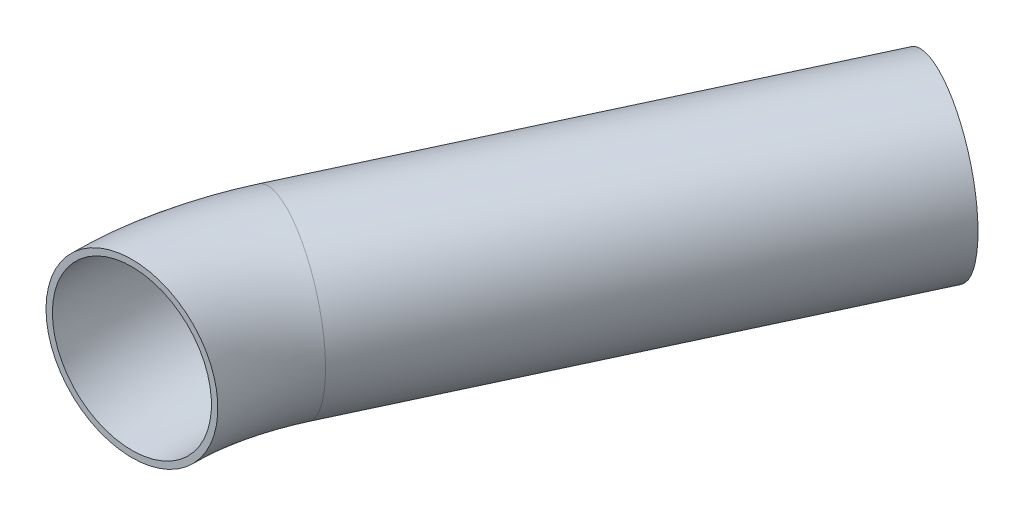
ISO-10303-21;
HEADER;
FILE_DESCRIPTION(('STEP AP214'),'2;1');
FILE_NAME('part.step','',(''),(''),'','','');
FILE_SCHEMA(('AUTOMOTIVE_DESIGN { 1 0 10303 214 1 1 1 1 }'));
ENDSEC;
DATA;
#1=APPLICATION_CONTEXT('core data for automotive mechanical design processes');
#2=APPLICATION_PROTOCOL_DEFINITION('international standard','automotive_design',2000,#1);
#3=PRODUCT_CONTEXT('',#1,'mechanical');
#4=PRODUCT('Part','Part','',(#3));
#5=PRODUCT_RELATED_PRODUCT_CATEGORY('part','',(#4));
#6=PRODUCT_DEFINITION_FORMATION('','',#4);
#7=PRODUCT_DEFINITION_CONTEXT('part definition',#1,'design');
#8=PRODUCT_DEFINITION('design','',#6,#7);
#9=PRODUCT_DEFINITION_SHAPE('','',#8);
#10=(LENGTH_UNIT() NAMED_UNIT(*) SI_UNIT(.MILLI.,.METRE.));
#11=(NAMED_UNIT(*) PLANE_ANGLE_UNIT() SI_UNIT($,.RADIAN.));
#12=(NAMED_UNIT(*) SI_UNIT($,.STERADIAN.) SOLID_ANGLE_UNIT());
#13=UNCERTAINTY_MEASURE_WITH_UNIT(LENGTH_MEASURE(1.E-05),#10,'distance_accuracy_value','');
#14=(GEOMETRIC_REPRESENTATION_CONTEXT(3) GLOBAL_UNCERTAINTY_ASSIGNED_CONTEXT((#13)) GLOBAL_UNIT_ASSIGNED_CONTEXT((#10,
#11,#12)) REPRESENTATION_CONTEXT('',''));
#15=CARTESIAN_POINT('',(0.,0.,0.));
#16=DIRECTION('',(0.,0.,1.));
#17=DIRECTION('',(1.,0.,0.));
#18=AXIS2_PLACEMENT_3D('',#15,#16,#17);
#19=CARTESIAN_POINT('',(7.13934662780705,0.,-32.2035115446408));
#20=DIRECTION('',(0.422618261740694,0.,-0.906307787036653));
#21=DIRECTION('',(-0.906307787036653,0.,-0.422618261740694));
#22=AXIS2_PLACEMENT_3D('',#19,#20,#21);
#23=CYLINDRICAL_SURFACE('',#22,22.225);
#24=CARTESIAN_POINT('',(7.13934662780705,0.,-32.2035115446408));
#25=DIRECTION('',(-0.422618261740693,0.,0.906307787036653));
#26=DIRECTION('',(0.906307787036653,0.,0.422618261740693));
#27=AXIS2_PLACEMENT_3D('',#24,#25,#26);
#28=CIRCLE('',#27,22.225);
#29=CARTESIAN_POINT('',(-13.0033439390825,0.,-41.5962024118277));
#30=VERTEX_POINT('',#29);
#31=EDGE_CURVE('E44',#30,#30,#28,.T.);
#32=ORIENTED_EDGE('',*,*,#31,.F.);
#33=EDGE_LOOP('',(#32));
#34=FACE_BOUND('',#33,.T.);
#35=CARTESIAN_POINT('',(60.8118658688752,0.,-147.304600498296));
#36=DIRECTION('',(-0.422618261740693,0.,0.906307787036653));
#37=DIRECTION('',(0.906307787036653,0.,0.422618261740693));
#38=AXIS2_PLACEMENT_3D('',#35,#36,#37);
#39=CIRCLE('',#38,22.225);
#40=CARTESIAN_POINT('',(80.9545564357648,0.,-137.911909631109));
#41=VERTEX_POINT('',#40);
#42=EDGE_CURVE('E10',#41,#41,#39,.T.);
#43=ORIENTED_EDGE('',*,*,#42,.T.);
#44=EDGE_LOOP('',(#43));
#45=FACE_BOUND('',#44,.T.);
#46=ADVANCED_FACE('F34',(#34,#45),#23,.T.);
#47=CARTESIAN_POINT('',(7.13934662780705,0.,-32.2035115446408));
#48=DIRECTION('',(0.422618261740694,0.,-0.906307787036653));
#49=DIRECTION('',(-0.906307787036653,0.,-0.422618261740694));
#50=AXIS2_PLACEMENT_3D('',#47,#48,#49);
#51=CYLINDRICAL_SURFACE('',#50,20.574);
#52=CARTESIAN_POINT('',(7.13934662780705,0.,-32.2035115446408));
#53=DIRECTION('',(-0.422618261740693,0.,0.906307787036653));
#54=DIRECTION('',(0.906307787036653,0.,0.422618261740693));
#55=AXIS2_PLACEMENT_3D('',#52,#53,#54);
#56=CIRCLE('',#55,20.574);
#57=CARTESIAN_POINT('',(-11.507029782685,0.,-40.8984596616939));
#58=VERTEX_POINT('',#57);
#59=EDGE_CURVE('E48',#58,#58,#56,.T.);
#60=ORIENTED_EDGE('',*,*,#59,.T.);
#61=EDGE_LOOP('',(#60));
#62=FACE_BOUND('',#61,.T.);
#63=CARTESIAN_POINT('',(60.8118658688752,0.,-147.304600498296));
#64=DIRECTION('',(-0.422618261740693,0.,0.906307787036653));
#65=DIRECTION('',(0.906307787036653,0.,0.422618261740693));
#66=AXIS2_PLACEMENT_3D('',#63,#64,#65);
#67=CIRCLE('',#66,20.574);
#68=CARTESIAN_POINT('',(79.4582422793673,0.,-138.609652381243));
#69=VERTEX_POINT('',#68);
#70=EDGE_CURVE('E40',#69,#69,#67,.T.);
#71=ORIENTED_EDGE('',*,*,#70,.F.);
#72=EDGE_LOOP('',(#71));
#73=FACE_BOUND('',#72,.T.);
#74=ADVANCED_FACE('F78',(#62,#73),#51,.F.);
#75=CARTESIAN_POINT('',(76.2,0.,0.));
#76=DIRECTION('',(0.,1.,0.));
#77=DIRECTION('',(0.,0.,1.));
#78=AXIS2_PLACEMENT_3D('',#75,#76,#77);
#79=TOROIDAL_SURFACE('',#78,76.2,20.574);
#80=CARTESIAN_POINT('',(0.,0.,0.));
#81=DIRECTION('',(0.,0.,1.));
#82=DIRECTION('',(1.,0.,0.));
#83=AXIS2_PLACEMENT_3D('',#80,#81,#82);
#84=CIRCLE('',#83,20.574);
#85=CARTESIAN_POINT('',(-20.574,0.,0.));
#86=VERTEX_POINT('',#85);
#87=EDGE_CURVE('E56',#86,#86,#84,.T.);
#88=CARTESIAN_POINT('',(76.2,0.,0.));
#89=DIRECTION('',(0.,1.,0.));
#90=DIRECTION('',(0.,0.,1.));
#91=AXIS2_PLACEMENT_3D('',#88,#89,#90);
#92=CIRCLE('',#91,96.774);
#93=EDGE_CURVE('',#58,#86,#92,.T.);
#94=ORIENTED_EDGE('',*,*,#59,.F.);
#95=ORIENTED_EDGE('',*,*,#87,.T.);
#96=ORIENTED_EDGE('',*,*,#93,.T.);
#97=ORIENTED_EDGE('',*,*,#93,.F.);
#98=EDGE_LOOP('',(#94,#96,#95,#97));
#99=FACE_BOUND('',#98,.T.);
#100=ADVANCED_FACE('F60',(#99),#79,.F.);
#101=CARTESIAN_POINT('',(76.2,0.,0.));
#102=DIRECTION('',(0.,1.,0.));
#103=DIRECTION('',(0.,0.,1.));
#104=AXIS2_PLACEMENT_3D('',#101,#102,#103);
#105=TOROIDAL_SURFACE('',#104,76.2,22.225);
#106=CARTESIAN_POINT('',(0.,0.,0.));
#107=DIRECTION('',(0.,0.,1.));
#108=DIRECTION('',(1.,0.,0.));
#109=AXIS2_PLACEMENT_3D('',#106,#107,#108);
#110=CIRCLE('',#109,22.225);
#111=CARTESIAN_POINT('',(-22.225,0.,0.));
#112=VERTEX_POINT('',#111);
#113=EDGE_CURVE('E53',#112,#112,#110,.T.);
#114=CARTESIAN_POINT('',(76.2,0.,0.));
#115=DIRECTION('',(0.,1.,0.));
#116=DIRECTION('',(0.,0.,1.));
#117=AXIS2_PLACEMENT_3D('',#114,#115,#116);
#118=CIRCLE('',#117,98.425);
#119=EDGE_CURVE('',#30,#112,#118,.T.);
#120=ORIENTED_EDGE('',*,*,#31,.T.);
#121=ORIENTED_EDGE('',*,*,#113,.F.);
#122=ORIENTED_EDGE('',*,*,#119,.T.);
#123=ORIENTED_EDGE('',*,*,#119,.F.);
#124=EDGE_LOOP('',(#120,#122,#121,#123));
#125=FACE_BOUND('',#124,.T.);
#126=ADVANCED_FACE('F67',(#125),#105,.T.);
#127=CARTESIAN_POINT('',(60.8118658688752,0.,-147.304600498296));
#128=DIRECTION('',(-0.422618261740693,0.,0.906307787036653));
#129=DIRECTION('',(0.906307787036653,0.,0.422618261740693));
#130=AXIS2_PLACEMENT_3D('',#127,#128,#129);
#131=PLANE('',#130);
#132=ORIENTED_EDGE('',*,*,#70,.T.);
#133=EDGE_LOOP('',(#132));
#134=FACE_BOUND('',#133,.T.);
#135=ORIENTED_EDGE('',*,*,#42,.F.);
#136=EDGE_LOOP('',(#135));
#137=FACE_BOUND('',#136,.T.);
#138=ADVANCED_FACE('F65',(#134,#137),#131,.F.);
#139=CARTESIAN_POINT('',(0.,0.,0.));
#140=DIRECTION('',(0.,0.,1.));
#141=DIRECTION('',(1.,0.,0.));
#142=AXIS2_PLACEMENT_3D('',#139,#140,#141);
#143=PLANE('',#142);
#144=ORIENTED_EDGE('',*,*,#87,.F.);
#145=EDGE_LOOP('',(#144));
#146=FACE_BOUND('',#145,.T.);
#147=ORIENTED_EDGE('',*,*,#113,.T.);
#148=EDGE_LOOP('',(#147));
#149=FACE_BOUND('',#148,.T.);
#150=ADVANCED_FACE('F62',(#146,#149),#143,.T.);
#151=CLOSED_SHELL('',(#46,#74,#100,#126,#138,#150));
#152=MANIFOLD_SOLID_BREP('B2',#151);
#153=ADVANCED_BREP_SHAPE_REPRESENTATION('',(#18,#152),#14);
#154=SHAPE_DEFINITION_REPRESENTATION(#9,#153);
ENDSEC;
END-ISO-10303-21;
